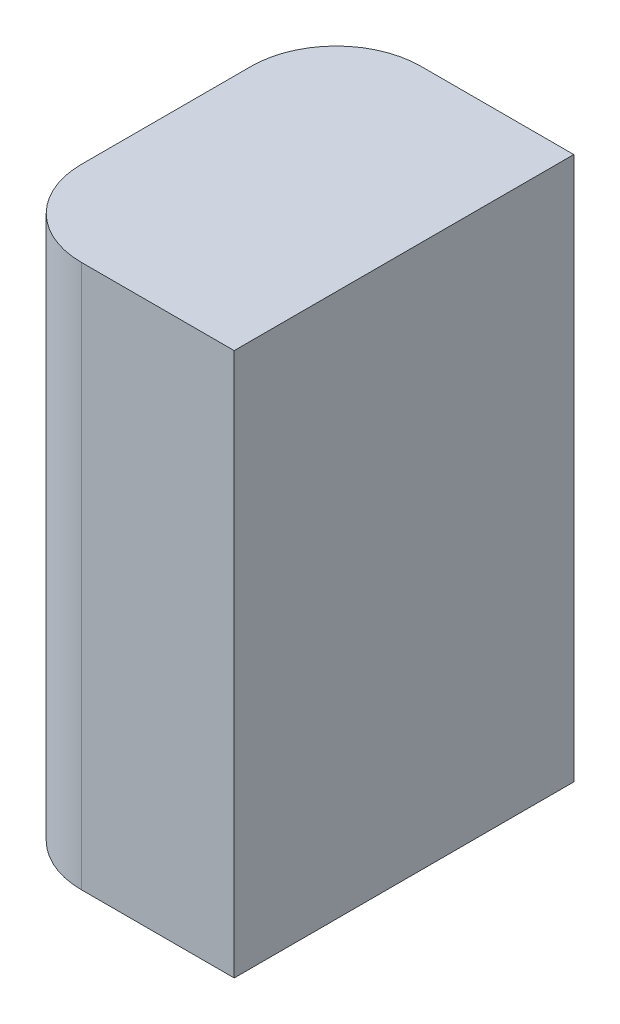
ISO-10303-21;
HEADER;
FILE_DESCRIPTION(('STEP AP214'),'2;1');
FILE_NAME('part.step','',(''),(''),'','','');
FILE_SCHEMA(('AUTOMOTIVE_DESIGN { 1 0 10303 214 1 1 1 1 }'));
ENDSEC;
DATA;
#1=APPLICATION_CONTEXT('core data for automotive mechanical design processes');
#2=APPLICATION_PROTOCOL_DEFINITION('international standard','automotive_design',2000,#1);
#3=PRODUCT_CONTEXT('',#1,'mechanical');
#4=PRODUCT('Part','Part','',(#3));
#5=PRODUCT_RELATED_PRODUCT_CATEGORY('part','',(#4));
#6=PRODUCT_DEFINITION_FORMATION('','',#4);
#7=PRODUCT_DEFINITION_CONTEXT('part definition',#1,'design');
#8=PRODUCT_DEFINITION('design','',#6,#7);
#9=PRODUCT_DEFINITION_SHAPE('','',#8);
#10=(LENGTH_UNIT() NAMED_UNIT(*) SI_UNIT(.MILLI.,.METRE.));
#11=(NAMED_UNIT(*) PLANE_ANGLE_UNIT() SI_UNIT($,.RADIAN.));
#12=(NAMED_UNIT(*) SI_UNIT($,.STERADIAN.) SOLID_ANGLE_UNIT());
#13=UNCERTAINTY_MEASURE_WITH_UNIT(LENGTH_MEASURE(1.E-05),#10,'distance_accuracy_value','');
#14=(GEOMETRIC_REPRESENTATION_CONTEXT(3) GLOBAL_UNCERTAINTY_ASSIGNED_CONTEXT((#13)) GLOBAL_UNIT_ASSIGNED_CONTEXT((#10,
#11,#12)) REPRESENTATION_CONTEXT('',''));
#15=CARTESIAN_POINT('',(0.,0.,0.));
#16=DIRECTION('',(0.,0.,1.));
#17=DIRECTION('',(1.,0.,0.));
#18=AXIS2_PLACEMENT_3D('',#15,#16,#17);
#19=CARTESIAN_POINT('',(88.9,203.2,0.));
#20=DIRECTION('',(-1.,0.,0.));
#21=DIRECTION('',(0.,0.,1.));
#22=AXIS2_PLACEMENT_3D('',#19,#20,#21);
#23=PLANE('',#22);
#24=DIRECTION('',(0.,0.,-1.));
#25=VECTOR('',#24,1.);
#26=CARTESIAN_POINT('',(88.9,0.,0.));
#27=LINE('',#26,#25);
#28=CARTESIAN_POINT('',(88.9,0.,0.));
#29=VERTEX_POINT('',#28);
#30=CARTESIAN_POINT('',(88.9,0.,-127.));
#31=VERTEX_POINT('',#30);
#32=EDGE_CURVE('E134',#29,#31,#27,.T.);
#33=ORIENTED_EDGE('',*,*,#32,.T.);
#34=DIRECTION('',(0.,-1.,0.));
#35=VECTOR('',#34,1.);
#36=CARTESIAN_POINT('',(88.9,203.2,-127.));
#37=LINE('',#36,#35);
#38=CARTESIAN_POINT('',(88.9,203.2,-127.));
#39=VERTEX_POINT('',#38);
#40=EDGE_CURVE('E11',#39,#31,#37,.T.);
#41=ORIENTED_EDGE('',*,*,#40,.F.);
#42=DIRECTION('',(0.,0.,-1.));
#43=VECTOR('',#42,1.);
#44=CARTESIAN_POINT('',(88.9,203.2,0.));
#45=LINE('',#44,#43);
#46=CARTESIAN_POINT('',(88.9,203.2,0.));
#47=VERTEX_POINT('',#46);
#48=EDGE_CURVE('E150',#47,#39,#45,.T.);
#49=ORIENTED_EDGE('',*,*,#48,.F.);
#50=DIRECTION('',(0.,-1.,0.));
#51=VECTOR('',#50,1.);
#52=CARTESIAN_POINT('',(88.9,203.2,0.));
#53=LINE('',#52,#51);
#54=EDGE_CURVE('E130',#47,#29,#53,.T.);
#55=ORIENTED_EDGE('',*,*,#54,.T.);
#56=EDGE_LOOP('',(#33,#41,#49,#55));
#57=FACE_BOUND('',#56,.T.);
#58=ADVANCED_FACE('F43',(#57),#23,.F.);
#59=CARTESIAN_POINT('',(31.7500000000002,203.2,-127.));
#60=DIRECTION('',(0.,0.,1.));
#61=DIRECTION('',(1.,0.,0.));
#62=AXIS2_PLACEMENT_3D('',#59,#60,#61);
#63=PLANE('',#62);
#64=DIRECTION('',(-1.,0.,0.));
#65=VECTOR('',#64,1.);
#66=CARTESIAN_POINT('',(31.7500000000002,0.,-127.));
#67=LINE('',#66,#65);
#68=CARTESIAN_POINT('',(31.7500000000002,0.,-127.));
#69=VERTEX_POINT('',#68);
#70=EDGE_CURVE('E138',#31,#69,#67,.T.);
#71=ORIENTED_EDGE('',*,*,#70,.T.);
#72=DIRECTION('',(0.,-1.,0.));
#73=VECTOR('',#72,1.);
#74=CARTESIAN_POINT('',(31.7500000000002,203.2,-127.));
#75=LINE('',#74,#73);
#76=CARTESIAN_POINT('',(31.7500000000002,203.2,-127.));
#77=VERTEX_POINT('',#76);
#78=EDGE_CURVE('E52',#77,#69,#75,.T.);
#79=ORIENTED_EDGE('',*,*,#78,.F.);
#80=DIRECTION('',(-1.,0.,0.));
#81=VECTOR('',#80,1.);
#82=CARTESIAN_POINT('',(31.7500000000002,203.2,-127.));
#83=LINE('',#82,#81);
#84=EDGE_CURVE('E102',#39,#77,#83,.T.);
#85=ORIENTED_EDGE('',*,*,#84,.F.);
#86=ORIENTED_EDGE('',*,*,#40,.T.);
#87=EDGE_LOOP('',(#71,#79,#85,#86));
#88=FACE_BOUND('',#87,.T.);
#89=ADVANCED_FACE('F177',(#88),#63,.F.);
#90=CARTESIAN_POINT('',(31.75,203.2,-95.25));
#91=DIRECTION('',(0.,-1.,0.));
#92=DIRECTION('',(0.,0.,-1.));
#93=AXIS2_PLACEMENT_3D('',#90,#91,#92);
#94=CYLINDRICAL_SURFACE('',#93,31.75);
#95=CARTESIAN_POINT('',(31.75,0.,-95.25));
#96=DIRECTION('',(0.,1.,0.));
#97=DIRECTION('',(0.,0.,-1.));
#98=AXIS2_PLACEMENT_3D('',#95,#96,#97);
#99=CIRCLE('',#98,31.75);
#100=CARTESIAN_POINT('',(0.,0.,-95.2499999999998));
#101=VERTEX_POINT('',#100);
#102=EDGE_CURVE('E141',#69,#101,#99,.T.);
#103=ORIENTED_EDGE('',*,*,#102,.T.);
#104=DIRECTION('',(0.,-1.,0.));
#105=VECTOR('',#104,1.);
#106=CARTESIAN_POINT('',(0.,203.2,-95.2499999999998));
#107=LINE('',#106,#105);
#108=CARTESIAN_POINT('',(0.,203.2,-95.2499999999998));
#109=VERTEX_POINT('',#108);
#110=EDGE_CURVE('E125',#109,#101,#107,.T.);
#111=ORIENTED_EDGE('',*,*,#110,.F.);
#112=CARTESIAN_POINT('',(31.75,203.2,-95.25));
#113=DIRECTION('',(0.,1.,0.));
#114=DIRECTION('',(0.,0.,-1.));
#115=AXIS2_PLACEMENT_3D('',#112,#113,#114);
#116=CIRCLE('',#115,31.75);
#117=EDGE_CURVE('E115',#77,#109,#116,.T.);
#118=ORIENTED_EDGE('',*,*,#117,.F.);
#119=ORIENTED_EDGE('',*,*,#78,.T.);
#120=EDGE_LOOP('',(#103,#111,#118,#119));
#121=FACE_BOUND('',#120,.T.);
#122=ADVANCED_FACE('F159',(#121),#94,.T.);
#123=CARTESIAN_POINT('',(0.,203.2,-31.7500000000002));
#124=DIRECTION('',(1.,0.,0.));
#125=DIRECTION('',(0.,0.,-1.));
#126=AXIS2_PLACEMENT_3D('',#123,#124,#125);
#127=PLANE('',#126);
#128=DIRECTION('',(0.,0.,1.));
#129=VECTOR('',#128,1.);
#130=CARTESIAN_POINT('',(0.,0.,-31.7500000000002));
#131=LINE('',#130,#129);
#132=CARTESIAN_POINT('',(0.,0.,-31.7500000000002));
#133=VERTEX_POINT('',#132);
#134=EDGE_CURVE('E123',#101,#133,#131,.T.);
#135=ORIENTED_EDGE('',*,*,#134,.T.);
#136=DIRECTION('',(0.,-1.,0.));
#137=VECTOR('',#136,1.);
#138=CARTESIAN_POINT('',(0.,203.2,-31.7500000000002));
#139=LINE('',#138,#137);
#140=CARTESIAN_POINT('',(0.,203.2,-31.7500000000002));
#141=VERTEX_POINT('',#140);
#142=EDGE_CURVE('E120',#141,#133,#139,.T.);
#143=ORIENTED_EDGE('',*,*,#142,.F.);
#144=DIRECTION('',(0.,0.,1.));
#145=VECTOR('',#144,1.);
#146=CARTESIAN_POINT('',(0.,203.2,-31.7500000000002));
#147=LINE('',#146,#145);
#148=EDGE_CURVE('E109',#109,#141,#147,.T.);
#149=ORIENTED_EDGE('',*,*,#148,.F.);
#150=ORIENTED_EDGE('',*,*,#110,.T.);
#151=EDGE_LOOP('',(#135,#143,#149,#150));
#152=FACE_BOUND('',#151,.T.);
#153=ADVANCED_FACE('F121',(#152),#127,.F.);
#154=CARTESIAN_POINT('',(31.75,203.2,-31.75));
#155=DIRECTION('',(0.,-1.,0.));
#156=DIRECTION('',(0.,0.,-1.));
#157=AXIS2_PLACEMENT_3D('',#154,#155,#156);
#158=CYLINDRICAL_SURFACE('',#157,31.75);
#159=CARTESIAN_POINT('',(31.75,0.,-31.75));
#160=DIRECTION('',(0.,1.,0.));
#161=DIRECTION('',(0.,0.,-1.));
#162=AXIS2_PLACEMENT_3D('',#159,#160,#161);
#163=CIRCLE('',#162,31.75);
#164=CARTESIAN_POINT('',(31.7500000000002,0.,0.));
#165=VERTEX_POINT('',#164);
#166=EDGE_CURVE('E87',#133,#165,#163,.T.);
#167=ORIENTED_EDGE('',*,*,#166,.T.);
#168=DIRECTION('',(0.,-1.,0.));
#169=VECTOR('',#168,1.);
#170=CARTESIAN_POINT('',(31.7500000000002,203.2,0.));
#171=LINE('',#170,#169);
#172=CARTESIAN_POINT('',(31.7500000000002,203.2,0.));
#173=VERTEX_POINT('',#172);
#174=EDGE_CURVE('E126',#173,#165,#171,.T.);
#175=ORIENTED_EDGE('',*,*,#174,.F.);
#176=CARTESIAN_POINT('',(31.75,203.2,-31.75));
#177=DIRECTION('',(0.,1.,0.));
#178=DIRECTION('',(0.,0.,-1.));
#179=AXIS2_PLACEMENT_3D('',#176,#177,#178);
#180=CIRCLE('',#179,31.75);
#181=EDGE_CURVE('E113',#141,#173,#180,.T.);
#182=ORIENTED_EDGE('',*,*,#181,.F.);
#183=ORIENTED_EDGE('',*,*,#142,.T.);
#184=EDGE_LOOP('',(#167,#175,#182,#183));
#185=FACE_BOUND('',#184,.T.);
#186=ADVANCED_FACE('F128',(#185),#158,.T.);
#187=CARTESIAN_POINT('',(31.7500000000002,203.2,0.));
#188=DIRECTION('',(0.,0.,-1.));
#189=DIRECTION('',(-1.,0.,0.));
#190=AXIS2_PLACEMENT_3D('',#187,#188,#189);
#191=PLANE('',#190);
#192=DIRECTION('',(1.,0.,0.));
#193=VECTOR('',#192,1.);
#194=CARTESIAN_POINT('',(31.7500000000002,0.,0.));
#195=LINE('',#194,#193);
#196=EDGE_CURVE('E94',#165,#29,#195,.T.);
#197=ORIENTED_EDGE('',*,*,#196,.T.);
#198=ORIENTED_EDGE('',*,*,#54,.F.);
#199=DIRECTION('',(1.,0.,0.));
#200=VECTOR('',#199,1.);
#201=CARTESIAN_POINT('',(31.7500000000002,203.2,0.));
#202=LINE('',#201,#200);
#203=EDGE_CURVE('E60',#173,#47,#202,.T.);
#204=ORIENTED_EDGE('',*,*,#203,.F.);
#205=ORIENTED_EDGE('',*,*,#174,.T.);
#206=EDGE_LOOP('',(#197,#198,#204,#205));
#207=FACE_BOUND('',#206,.T.);
#208=ADVANCED_FACE('F166',(#207),#191,.F.);
#209=CARTESIAN_POINT('',(31.75,203.2,-95.25));
#210=DIRECTION('',(0.,-1.,0.));
#211=DIRECTION('',(0.,0.,-1.));
#212=AXIS2_PLACEMENT_3D('',#209,#210,#211);
#213=PLANE('',#212);
#214=ORIENTED_EDGE('',*,*,#48,.T.);
#215=ORIENTED_EDGE('',*,*,#84,.T.);
#216=ORIENTED_EDGE('',*,*,#117,.T.);
#217=ORIENTED_EDGE('',*,*,#148,.T.);
#218=ORIENTED_EDGE('',*,*,#181,.T.);
#219=ORIENTED_EDGE('',*,*,#203,.T.);
#220=EDGE_LOOP('',(#214,#215,#216,#217,#218,#219));
#221=FACE_BOUND('',#220,.T.);
#222=ADVANCED_FACE('F111',(#221),#213,.F.);
#223=CARTESIAN_POINT('',(31.75,0.,-95.25));
#224=DIRECTION('',(0.,-1.,0.));
#225=DIRECTION('',(0.,0.,-1.));
#226=AXIS2_PLACEMENT_3D('',#223,#224,#225);
#227=PLANE('',#226);
#228=ORIENTED_EDGE('',*,*,#32,.F.);
#229=ORIENTED_EDGE('',*,*,#196,.F.);
#230=ORIENTED_EDGE('',*,*,#166,.F.);
#231=ORIENTED_EDGE('',*,*,#134,.F.);
#232=ORIENTED_EDGE('',*,*,#102,.F.);
#233=ORIENTED_EDGE('',*,*,#70,.F.);
#234=EDGE_LOOP('',(#228,#229,#230,#231,#232,#233));
#235=FACE_BOUND('',#234,.T.);
#236=ADVANCED_FACE('F162',(#235),#227,.T.);
#237=CLOSED_SHELL('',(#58,#89,#122,#153,#186,#208,#222,#236));
#238=MANIFOLD_SOLID_BREP('B2',#237);
#239=ADVANCED_BREP_SHAPE_REPRESENTATION('',(#18,#238),#14);
#240=SHAPE_DEFINITION_REPRESENTATION(#9,#239);
ENDSEC;
END-ISO-10303-21;
